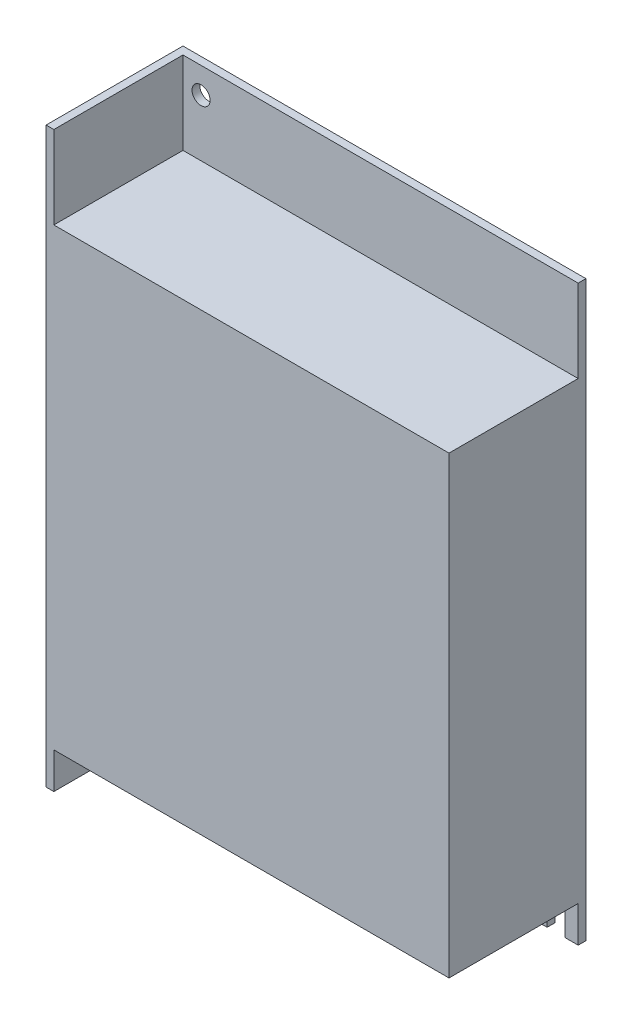
ISO-10303-21;
HEADER;
FILE_DESCRIPTION(('STEP AP214'),'2;1');
FILE_NAME('part.step','',(''),(''),'','','');
FILE_SCHEMA(('AUTOMOTIVE_DESIGN { 1 0 10303 214 1 1 1 1 }'));
ENDSEC;
DATA;
#1=APPLICATION_CONTEXT('core data for automotive mechanical design processes');
#2=APPLICATION_PROTOCOL_DEFINITION('international standard','automotive_design',2000,#1);
#3=PRODUCT_CONTEXT('',#1,'mechanical');
#4=PRODUCT('Part','Part','',(#3));
#5=PRODUCT_RELATED_PRODUCT_CATEGORY('part','',(#4));
#6=PRODUCT_DEFINITION_FORMATION('','',#4);
#7=PRODUCT_DEFINITION_CONTEXT('part definition',#1,'design');
#8=PRODUCT_DEFINITION('design','',#6,#7);
#9=PRODUCT_DEFINITION_SHAPE('','',#8);
#10=(LENGTH_UNIT() NAMED_UNIT(*) SI_UNIT(.MILLI.,.METRE.));
#11=(NAMED_UNIT(*) PLANE_ANGLE_UNIT() SI_UNIT($,.RADIAN.));
#12=(NAMED_UNIT(*) SI_UNIT($,.STERADIAN.) SOLID_ANGLE_UNIT());
#13=UNCERTAINTY_MEASURE_WITH_UNIT(LENGTH_MEASURE(1.E-05),#10,'distance_accuracy_value','');
#14=(GEOMETRIC_REPRESENTATION_CONTEXT(3) GLOBAL_UNCERTAINTY_ASSIGNED_CONTEXT((#13)) GLOBAL_UNIT_ASSIGNED_CONTEXT((#10,
#11,#12)) REPRESENTATION_CONTEXT('',''));
#15=CARTESIAN_POINT('',(0.,0.,0.));
#16=DIRECTION('',(0.,0.,1.));
#17=DIRECTION('',(1.,0.,0.));
#18=AXIS2_PLACEMENT_3D('',#15,#16,#17);
#19=CARTESIAN_POINT('',(0.,0.,1.5));
#20=DIRECTION('',(0.,0.,1.));
#21=DIRECTION('',(1.,0.,0.));
#22=AXIS2_PLACEMENT_3D('',#19,#20,#21);
#23=PLANE('',#22);
#24=CARTESIAN_POINT('',(5.,106.,1.5));
#25=DIRECTION('',(0.,0.,1.));
#26=DIRECTION('',(1.,0.,0.));
#27=AXIS2_PLACEMENT_3D('',#24,#25,#26);
#28=CIRCLE('',#27,1.75);
#29=CARTESIAN_POINT('',(6.75000000000001,106.,1.5));
#30=VERTEX_POINT('',#29);
#31=EDGE_CURVE('E173',#30,#30,#28,.T.);
#32=ORIENTED_EDGE('',*,*,#31,.F.);
#33=EDGE_LOOP('',(#32));
#34=FACE_BOUND('',#33,.T.);
#35=DIRECTION('',(0.,-1.,0.));
#36=VECTOR('',#35,1.);
#37=CARTESIAN_POINT('',(1.50000000000001,0.,1.5));
#38=LINE('',#37,#36);
#39=CARTESIAN_POINT('',(1.5,111.,1.5));
#40=VERTEX_POINT('',#39);
#41=CARTESIAN_POINT('',(1.5,95.,1.5));
#42=VERTEX_POINT('',#41);
#43=EDGE_CURVE('E300',#40,#42,#38,.T.);
#44=ORIENTED_EDGE('',*,*,#43,.T.);
#45=DIRECTION('',(1.,0.,0.));
#46=VECTOR('',#45,1.);
#47=CARTESIAN_POINT('',(0.,95.,1.5));
#48=LINE('',#47,#46);
#49=CARTESIAN_POINT('',(78.,95.,1.5));
#50=VERTEX_POINT('',#49);
#51=EDGE_CURVE('E50',#42,#50,#48,.T.);
#52=ORIENTED_EDGE('',*,*,#51,.T.);
#53=DIRECTION('',(0.,1.,0.));
#54=VECTOR('',#53,1.);
#55=CARTESIAN_POINT('',(78.,0.,1.5));
#56=LINE('',#55,#54);
#57=CARTESIAN_POINT('',(78.,111.,1.5));
#58=VERTEX_POINT('',#57);
#59=EDGE_CURVE('E125',#50,#58,#56,.T.);
#60=ORIENTED_EDGE('',*,*,#59,.T.);
#61=DIRECTION('',(1.,0.,0.));
#62=VECTOR('',#61,1.);
#63=CARTESIAN_POINT('',(0.,111.,1.5));
#64=LINE('',#63,#62);
#65=EDGE_CURVE('E107',#40,#58,#64,.T.);
#66=ORIENTED_EDGE('',*,*,#65,.F.);
#67=EDGE_LOOP('',(#44,#52,#60,#66));
#68=FACE_BOUND('',#67,.T.);
#69=ADVANCED_FACE('F35',(#34,#68),#23,.T.);
#70=CARTESIAN_POINT('',(73.75,4.24999999999999,1.5));
#71=DIRECTION('',(0.,0.,-1.));
#72=DIRECTION('',(-1.,0.,0.));
#73=AXIS2_PLACEMENT_3D('',#70,#71,#72);
#74=CYLINDRICAL_SURFACE('',#73,1.75);
#75=CARTESIAN_POINT('',(73.75,4.24999999999999,0.));
#76=DIRECTION('',(0.,0.,1.));
#77=DIRECTION('',(1.,0.,0.));
#78=AXIS2_PLACEMENT_3D('',#75,#76,#77);
#79=CIRCLE('',#78,1.75);
#80=CARTESIAN_POINT('',(75.5,4.24999999999999,0.));
#81=VERTEX_POINT('',#80);
#82=CARTESIAN_POINT('',(72.,4.24999999999999,0.));
#83=VERTEX_POINT('',#82);
#84=EDGE_CURVE('E156',#81,#83,#79,.T.);
#85=ORIENTED_EDGE('',*,*,#84,.F.);
#86=DIRECTION('',(0.,0.,-1.));
#87=VECTOR('',#86,1.);
#88=CARTESIAN_POINT('',(75.5,4.24999999999999,1.5));
#89=LINE('',#88,#87);
#90=CARTESIAN_POINT('',(75.5,4.24999999999999,1.5));
#91=VERTEX_POINT('',#90);
#92=EDGE_CURVE('E11',#91,#81,#89,.T.);
#93=ORIENTED_EDGE('',*,*,#92,.F.);
#94=CARTESIAN_POINT('',(73.75,4.24999999999999,1.5));
#95=DIRECTION('',(0.,0.,1.));
#96=DIRECTION('',(1.,0.,0.));
#97=AXIS2_PLACEMENT_3D('',#94,#95,#96);
#98=CIRCLE('',#97,1.75);
#99=CARTESIAN_POINT('',(72.,4.24999999999999,1.5));
#100=VERTEX_POINT('',#99);
#101=EDGE_CURVE('E210',#91,#100,#98,.T.);
#102=ORIENTED_EDGE('',*,*,#101,.T.);
#103=DIRECTION('',(0.,0.,-1.));
#104=VECTOR('',#103,1.);
#105=CARTESIAN_POINT('',(72.,4.24999999999999,1.5));
#106=LINE('',#105,#104);
#107=EDGE_CURVE('E59',#100,#83,#106,.T.);
#108=ORIENTED_EDGE('',*,*,#107,.T.);
#109=EDGE_LOOP('',(#85,#93,#102,#108));
#110=FACE_BOUND('',#109,.T.);
#111=ADVANCED_FACE('F229',(#110),#74,.F.);
#112=CARTESIAN_POINT('',(75.5,0.,1.5));
#113=DIRECTION('',(1.,0.,0.));
#114=DIRECTION('',(0.,0.,-1.));
#115=AXIS2_PLACEMENT_3D('',#112,#113,#114);
#116=PLANE('',#115);
#117=DIRECTION('',(0.,-1.,0.));
#118=VECTOR('',#117,1.);
#119=CARTESIAN_POINT('',(75.5,0.,0.));
#120=LINE('',#119,#118);
#121=CARTESIAN_POINT('',(75.5,0.,0.));
#122=VERTEX_POINT('',#121);
#123=EDGE_CURVE('E153',#81,#122,#120,.T.);
#124=ORIENTED_EDGE('',*,*,#123,.T.);
#125=DIRECTION('',(0.,0.,-1.));
#126=VECTOR('',#125,1.);
#127=CARTESIAN_POINT('',(75.5,0.,1.5));
#128=LINE('',#127,#126);
#129=CARTESIAN_POINT('',(75.5,0.,1.5));
#130=VERTEX_POINT('',#129);
#131=EDGE_CURVE('E43',#130,#122,#128,.T.);
#132=ORIENTED_EDGE('',*,*,#131,.F.);
#133=DIRECTION('',(0.,-1.,0.));
#134=VECTOR('',#133,1.);
#135=CARTESIAN_POINT('',(75.5,0.,1.5));
#136=LINE('',#135,#134);
#137=EDGE_CURVE('E208',#91,#130,#136,.T.);
#138=ORIENTED_EDGE('',*,*,#137,.F.);
#139=ORIENTED_EDGE('',*,*,#92,.T.);
#140=EDGE_LOOP('',(#124,#132,#138,#139));
#141=FACE_BOUND('',#140,.T.);
#142=ADVANCED_FACE('F154',(#141),#116,.F.);
#143=CARTESIAN_POINT('',(0.,0.,1.5));
#144=DIRECTION('',(0.,1.,0.));
#145=DIRECTION('',(0.,0.,1.));
#146=AXIS2_PLACEMENT_3D('',#143,#144,#145);
#147=PLANE('',#146);
#148=DIRECTION('',(1.,0.,0.));
#149=VECTOR('',#148,1.);
#150=CARTESIAN_POINT('',(0.,0.,0.));
#151=LINE('',#150,#149);
#152=CARTESIAN_POINT('',(78.,0.,0.));
#153=VERTEX_POINT('',#152);
#154=EDGE_CURVE('E148',#122,#153,#151,.T.);
#155=ORIENTED_EDGE('',*,*,#154,.T.);
#156=DIRECTION('',(0.,0.,-1.));
#157=VECTOR('',#156,1.);
#158=CARTESIAN_POINT('',(78.,0.,1.5));
#159=LINE('',#158,#157);
#160=CARTESIAN_POINT('',(78.,0.,1.5));
#161=VERTEX_POINT('',#160);
#162=EDGE_CURVE('E134',#161,#153,#159,.T.);
#163=ORIENTED_EDGE('',*,*,#162,.F.);
#164=DIRECTION('',(1.,0.,0.));
#165=VECTOR('',#164,1.);
#166=CARTESIAN_POINT('',(0.,0.,1.5));
#167=LINE('',#166,#165);
#168=EDGE_CURVE('E128',#130,#161,#167,.T.);
#169=ORIENTED_EDGE('',*,*,#168,.F.);
#170=ORIENTED_EDGE('',*,*,#131,.T.);
#171=EDGE_LOOP('',(#155,#163,#169,#170));
#172=FACE_BOUND('',#171,.T.);
#173=ADVANCED_FACE('F146',(#172),#147,.F.);
#174=CARTESIAN_POINT('',(78.,0.,1.5));
#175=DIRECTION('',(-1.,0.,0.));
#176=DIRECTION('',(0.,0.,1.));
#177=AXIS2_PLACEMENT_3D('',#174,#175,#176);
#178=PLANE('',#177);
#179=DIRECTION('',(0.,1.,0.));
#180=VECTOR('',#179,1.);
#181=CARTESIAN_POINT('',(78.,0.,0.));
#182=LINE('',#181,#180);
#183=CARTESIAN_POINT('',(78.,111.,0.));
#184=VERTEX_POINT('',#183);
#185=EDGE_CURVE('E132',#153,#184,#182,.T.);
#186=ORIENTED_EDGE('',*,*,#185,.T.);
#187=DIRECTION('',(0.,0.,-1.));
#188=VECTOR('',#187,1.);
#189=CARTESIAN_POINT('',(78.,111.,1.5));
#190=LINE('',#189,#188);
#191=EDGE_CURVE('E112',#58,#184,#190,.T.);
#192=ORIENTED_EDGE('',*,*,#191,.F.);
#193=ORIENTED_EDGE('',*,*,#59,.F.);
#194=DIRECTION('',(0.,0.,-1.));
#195=VECTOR('',#194,1.);
#196=CARTESIAN_POINT('',(78.,95.,26.5));
#197=LINE('',#196,#195);
#198=CARTESIAN_POINT('',(78.,95.,26.5));
#199=VERTEX_POINT('',#198);
#200=EDGE_CURVE('E298',#199,#50,#197,.T.);
#201=ORIENTED_EDGE('',*,*,#200,.F.);
#202=DIRECTION('',(0.,1.,0.));
#203=VECTOR('',#202,1.);
#204=CARTESIAN_POINT('',(78.,0.,26.5));
#205=LINE('',#204,#203);
#206=CARTESIAN_POINT('',(78.,7.,26.5));
#207=VERTEX_POINT('',#206);
#208=EDGE_CURVE('E279',#207,#199,#205,.T.);
#209=ORIENTED_EDGE('',*,*,#208,.F.);
#210=DIRECTION('',(0.,0.,-1.));
#211=VECTOR('',#210,1.);
#212=CARTESIAN_POINT('',(78.,7.,26.5));
#213=LINE('',#212,#211);
#214=CARTESIAN_POINT('',(78.,7.,1.5));
#215=VERTEX_POINT('',#214);
#216=EDGE_CURVE('E203',#207,#215,#213,.T.);
#217=ORIENTED_EDGE('',*,*,#216,.T.);
#218=EDGE_CURVE('E122',#161,#215,#56,.T.);
#219=ORIENTED_EDGE('',*,*,#218,.F.);
#220=ORIENTED_EDGE('',*,*,#162,.T.);
#221=EDGE_LOOP('',(#186,#192,#193,#201,#209,#217,#219,#220));
#222=FACE_BOUND('',#221,.T.);
#223=ADVANCED_FACE('F130',(#222),#178,.F.);
#224=CARTESIAN_POINT('',(0.,111.,1.5));
#225=DIRECTION('',(0.,1.,0.));
#226=DIRECTION('',(0.,0.,1.));
#227=AXIS2_PLACEMENT_3D('',#224,#225,#226);
#228=PLANE('',#227);
#229=DIRECTION('',(1.,0.,0.));
#230=VECTOR('',#229,1.);
#231=CARTESIAN_POINT('',(0.,111.,0.));
#232=LINE('',#231,#230);
#233=CARTESIAN_POINT('',(0.,111.,0.));
#234=VERTEX_POINT('',#233);
#235=EDGE_CURVE('E165',#234,#184,#232,.T.);
#236=ORIENTED_EDGE('',*,*,#235,.F.);
#237=DIRECTION('',(0.,0.,-1.));
#238=VECTOR('',#237,1.);
#239=CARTESIAN_POINT('',(0.,111.,1.5));
#240=LINE('',#239,#238);
#241=CARTESIAN_POINT('',(0.,111.,26.5));
#242=VERTEX_POINT('',#241);
#243=EDGE_CURVE('E135',#242,#234,#240,.T.);
#244=ORIENTED_EDGE('',*,*,#243,.F.);
#245=DIRECTION('',(-1.,0.,0.));
#246=VECTOR('',#245,1.);
#247=CARTESIAN_POINT('',(0.,111.,26.5));
#248=LINE('',#247,#246);
#249=CARTESIAN_POINT('',(1.5,111.,26.5));
#250=VERTEX_POINT('',#249);
#251=EDGE_CURVE('E283',#250,#242,#248,.T.);
#252=ORIENTED_EDGE('',*,*,#251,.F.);
#253=DIRECTION('',(0.,0.,-1.));
#254=VECTOR('',#253,1.);
#255=CARTESIAN_POINT('',(1.5,111.,26.5));
#256=LINE('',#255,#254);
#257=EDGE_CURVE('E117',#250,#40,#256,.T.);
#258=ORIENTED_EDGE('',*,*,#257,.T.);
#259=ORIENTED_EDGE('',*,*,#65,.T.);
#260=ORIENTED_EDGE('',*,*,#191,.T.);
#261=EDGE_LOOP('',(#236,#244,#252,#258,#259,#260));
#262=FACE_BOUND('',#261,.T.);
#263=ADVANCED_FACE('F110',(#262),#228,.T.);
#264=CARTESIAN_POINT('',(0.,0.,1.5));
#265=DIRECTION('',(-1.,0.,0.));
#266=DIRECTION('',(0.,0.,1.));
#267=AXIS2_PLACEMENT_3D('',#264,#265,#266);
#268=PLANE('',#267);
#269=DIRECTION('',(0.,1.,0.));
#270=VECTOR('',#269,1.);
#271=CARTESIAN_POINT('',(0.,0.,0.));
#272=LINE('',#271,#270);
#273=CARTESIAN_POINT('',(0.,0.,0.));
#274=VERTEX_POINT('',#273);
#275=EDGE_CURVE('E167',#274,#234,#272,.T.);
#276=ORIENTED_EDGE('',*,*,#275,.F.);
#277=DIRECTION('',(0.,0.,-1.));
#278=VECTOR('',#277,1.);
#279=CARTESIAN_POINT('',(0.,0.,1.5));
#280=LINE('',#279,#278);
#281=CARTESIAN_POINT('',(0.,0.,26.5));
#282=VERTEX_POINT('',#281);
#283=EDGE_CURVE('E138',#282,#274,#280,.T.);
#284=ORIENTED_EDGE('',*,*,#283,.F.);
#285=DIRECTION('',(0.,-1.,0.));
#286=VECTOR('',#285,1.);
#287=CARTESIAN_POINT('',(0.,0.,26.5));
#288=LINE('',#287,#286);
#289=EDGE_CURVE('E196',#242,#282,#288,.T.);
#290=ORIENTED_EDGE('',*,*,#289,.F.);
#291=ORIENTED_EDGE('',*,*,#243,.T.);
#292=EDGE_LOOP('',(#276,#284,#290,#291));
#293=FACE_BOUND('',#292,.T.);
#294=ADVANCED_FACE('F193',(#293),#268,.T.);
#295=CARTESIAN_POINT('',(72.,0.,0.));
#296=VERTEX_POINT('',#295);
#297=EDGE_CURVE('E159',#274,#296,#151,.T.);
#298=ORIENTED_EDGE('',*,*,#297,.T.);
#299=DIRECTION('',(0.,0.,-1.));
#300=VECTOR('',#299,1.);
#301=CARTESIAN_POINT('',(72.,0.,1.5));
#302=LINE('',#301,#300);
#303=CARTESIAN_POINT('',(72.,0.,1.5));
#304=VERTEX_POINT('',#303);
#305=EDGE_CURVE('E175',#304,#296,#302,.T.);
#306=ORIENTED_EDGE('',*,*,#305,.F.);
#307=CARTESIAN_POINT('',(1.50000000000001,0.,1.5));
#308=VERTEX_POINT('',#307);
#309=EDGE_CURVE('E121',#308,#304,#167,.T.);
#310=ORIENTED_EDGE('',*,*,#309,.F.);
#311=DIRECTION('',(0.,0.,-1.));
#312=VECTOR('',#311,1.);
#313=CARTESIAN_POINT('',(1.50000000000001,0.,26.5));
#314=LINE('',#313,#312);
#315=CARTESIAN_POINT('',(1.50000000000001,0.,26.5));
#316=VERTEX_POINT('',#315);
#317=EDGE_CURVE('E223',#316,#308,#314,.T.);
#318=ORIENTED_EDGE('',*,*,#317,.F.);
#319=DIRECTION('',(1.,0.,0.));
#320=VECTOR('',#319,1.);
#321=CARTESIAN_POINT('',(0.,0.,26.5));
#322=LINE('',#321,#320);
#323=EDGE_CURVE('E187',#282,#316,#322,.T.);
#324=ORIENTED_EDGE('',*,*,#323,.F.);
#325=ORIENTED_EDGE('',*,*,#283,.T.);
#326=EDGE_LOOP('',(#298,#306,#310,#318,#324,#325));
#327=FACE_BOUND('',#326,.T.);
#328=ADVANCED_FACE('F182',(#327),#147,.F.);
#329=CARTESIAN_POINT('',(5.,106.,1.5));
#330=DIRECTION('',(0.,0.,-1.));
#331=DIRECTION('',(-1.,0.,0.));
#332=AXIS2_PLACEMENT_3D('',#329,#330,#331);
#333=CYLINDRICAL_SURFACE('',#332,1.75);
#334=ORIENTED_EDGE('',*,*,#31,.T.);
#335=EDGE_LOOP('',(#334));
#336=FACE_BOUND('',#335,.T.);
#337=CARTESIAN_POINT('',(5.,106.,0.));
#338=DIRECTION('',(0.,0.,1.));
#339=DIRECTION('',(1.,0.,0.));
#340=AXIS2_PLACEMENT_3D('',#337,#338,#339);
#341=CIRCLE('',#340,1.75);
#342=CARTESIAN_POINT('',(6.75000000000001,106.,0.));
#343=VERTEX_POINT('',#342);
#344=EDGE_CURVE('E160',#343,#343,#341,.T.);
#345=ORIENTED_EDGE('',*,*,#344,.F.);
#346=EDGE_LOOP('',(#345));
#347=FACE_BOUND('',#346,.T.);
#348=ADVANCED_FACE('F37',(#336,#347),#333,.F.);
#349=CARTESIAN_POINT('',(72.,0.,1.5));
#350=DIRECTION('',(1.,0.,0.));
#351=DIRECTION('',(0.,0.,-1.));
#352=AXIS2_PLACEMENT_3D('',#349,#350,#351);
#353=PLANE('',#352);
#354=DIRECTION('',(0.,-1.,0.));
#355=VECTOR('',#354,1.);
#356=CARTESIAN_POINT('',(72.,0.,0.));
#357=LINE('',#356,#355);
#358=EDGE_CURVE('E170',#83,#296,#357,.T.);
#359=ORIENTED_EDGE('',*,*,#358,.F.);
#360=ORIENTED_EDGE('',*,*,#107,.F.);
#361=DIRECTION('',(0.,-1.,0.));
#362=VECTOR('',#361,1.);
#363=CARTESIAN_POINT('',(72.,0.,1.5));
#364=LINE('',#363,#362);
#365=EDGE_CURVE('E176',#100,#304,#364,.T.);
#366=ORIENTED_EDGE('',*,*,#365,.T.);
#367=ORIENTED_EDGE('',*,*,#305,.T.);
#368=EDGE_LOOP('',(#359,#360,#366,#367));
#369=FACE_BOUND('',#368,.T.);
#370=ADVANCED_FACE('F247',(#369),#353,.T.);
#371=DIRECTION('',(1.,0.,0.));
#372=VECTOR('',#371,1.);
#373=CARTESIAN_POINT('',(0.,7.,1.5));
#374=LINE('',#373,#372);
#375=CARTESIAN_POINT('',(1.50000000000001,7.,1.5));
#376=VERTEX_POINT('',#375);
#377=EDGE_CURVE('E281',#376,#215,#374,.T.);
#378=ORIENTED_EDGE('',*,*,#377,.F.);
#379=EDGE_CURVE('E302',#376,#308,#38,.T.);
#380=ORIENTED_EDGE('',*,*,#379,.T.);
#381=ORIENTED_EDGE('',*,*,#309,.T.);
#382=ORIENTED_EDGE('',*,*,#365,.F.);
#383=ORIENTED_EDGE('',*,*,#101,.F.);
#384=ORIENTED_EDGE('',*,*,#137,.T.);
#385=ORIENTED_EDGE('',*,*,#168,.T.);
#386=ORIENTED_EDGE('',*,*,#218,.T.);
#387=EDGE_LOOP('',(#378,#380,#381,#382,#383,#384,#385,#386));
#388=FACE_BOUND('',#387,.T.);
#389=ADVANCED_FACE('F206',(#388),#23,.T.);
#390=CARTESIAN_POINT('',(0.,0.,0.));
#391=DIRECTION('',(0.,0.,1.));
#392=DIRECTION('',(1.,0.,0.));
#393=AXIS2_PLACEMENT_3D('',#390,#391,#392);
#394=PLANE('',#393);
#395=ORIENTED_EDGE('',*,*,#344,.T.);
#396=EDGE_LOOP('',(#395));
#397=FACE_BOUND('',#396,.T.);
#398=ORIENTED_EDGE('',*,*,#84,.T.);
#399=ORIENTED_EDGE('',*,*,#358,.T.);
#400=ORIENTED_EDGE('',*,*,#297,.F.);
#401=ORIENTED_EDGE('',*,*,#275,.T.);
#402=ORIENTED_EDGE('',*,*,#235,.T.);
#403=ORIENTED_EDGE('',*,*,#185,.F.);
#404=ORIENTED_EDGE('',*,*,#154,.F.);
#405=ORIENTED_EDGE('',*,*,#123,.F.);
#406=EDGE_LOOP('',(#398,#399,#400,#401,#402,#403,#404,#405));
#407=FACE_BOUND('',#406,.T.);
#408=ADVANCED_FACE('F192',(#397,#407),#394,.F.);
#409=CARTESIAN_POINT('',(0.,95.,26.5));
#410=DIRECTION('',(0.,1.,0.));
#411=DIRECTION('',(0.,0.,1.));
#412=AXIS2_PLACEMENT_3D('',#409,#410,#411);
#413=PLANE('',#412);
#414=ORIENTED_EDGE('',*,*,#51,.F.);
#415=DIRECTION('',(0.,0.,-1.));
#416=VECTOR('',#415,1.);
#417=CARTESIAN_POINT('',(1.5,95.,26.5));
#418=LINE('',#417,#416);
#419=CARTESIAN_POINT('',(1.5,95.,26.5));
#420=VERTEX_POINT('',#419);
#421=EDGE_CURVE('E217',#420,#42,#418,.T.);
#422=ORIENTED_EDGE('',*,*,#421,.F.);
#423=DIRECTION('',(1.,0.,0.));
#424=VECTOR('',#423,1.);
#425=CARTESIAN_POINT('',(0.,95.,26.5));
#426=LINE('',#425,#424);
#427=EDGE_CURVE('E275',#420,#199,#426,.T.);
#428=ORIENTED_EDGE('',*,*,#427,.T.);
#429=ORIENTED_EDGE('',*,*,#200,.T.);
#430=EDGE_LOOP('',(#414,#422,#428,#429));
#431=FACE_BOUND('',#430,.T.);
#432=ADVANCED_FACE('F251',(#431),#413,.T.);
#433=CARTESIAN_POINT('',(1.50000000000001,0.,26.5));
#434=DIRECTION('',(1.,0.,0.));
#435=DIRECTION('',(0.,1.,0.));
#436=AXIS2_PLACEMENT_3D('',#433,#434,#435);
#437=PLANE('',#436);
#438=ORIENTED_EDGE('',*,*,#43,.F.);
#439=ORIENTED_EDGE('',*,*,#257,.F.);
#440=DIRECTION('',(0.,-1.,0.));
#441=VECTOR('',#440,1.);
#442=CARTESIAN_POINT('',(1.50000000000001,0.,26.5));
#443=LINE('',#442,#441);
#444=EDGE_CURVE('E277',#250,#420,#443,.T.);
#445=ORIENTED_EDGE('',*,*,#444,.T.);
#446=ORIENTED_EDGE('',*,*,#421,.T.);
#447=EDGE_LOOP('',(#438,#439,#445,#446));
#448=FACE_BOUND('',#447,.T.);
#449=ADVANCED_FACE('F256',(#448),#437,.T.);
#450=ORIENTED_EDGE('',*,*,#379,.F.);
#451=DIRECTION('',(0.,0.,-1.));
#452=VECTOR('',#451,1.);
#453=CARTESIAN_POINT('',(1.50000000000001,7.,26.5));
#454=LINE('',#453,#452);
#455=CARTESIAN_POINT('',(1.50000000000001,7.,26.5));
#456=VERTEX_POINT('',#455);
#457=EDGE_CURVE('E307',#456,#376,#454,.T.);
#458=ORIENTED_EDGE('',*,*,#457,.F.);
#459=EDGE_CURVE('E285',#456,#316,#443,.T.);
#460=ORIENTED_EDGE('',*,*,#459,.T.);
#461=ORIENTED_EDGE('',*,*,#317,.T.);
#462=EDGE_LOOP('',(#450,#458,#460,#461));
#463=FACE_BOUND('',#462,.T.);
#464=ADVANCED_FACE('F257',(#463),#437,.T.);
#465=CARTESIAN_POINT('',(0.,7.,26.5));
#466=DIRECTION('',(0.,1.,0.));
#467=DIRECTION('',(0.,0.,1.));
#468=AXIS2_PLACEMENT_3D('',#465,#466,#467);
#469=PLANE('',#468);
#470=ORIENTED_EDGE('',*,*,#377,.T.);
#471=ORIENTED_EDGE('',*,*,#216,.F.);
#472=DIRECTION('',(1.,0.,0.));
#473=VECTOR('',#472,1.);
#474=CARTESIAN_POINT('',(0.,7.,26.5));
#475=LINE('',#474,#473);
#476=EDGE_CURVE('E288',#456,#207,#475,.T.);
#477=ORIENTED_EDGE('',*,*,#476,.F.);
#478=ORIENTED_EDGE('',*,*,#457,.T.);
#479=EDGE_LOOP('',(#470,#471,#477,#478));
#480=FACE_BOUND('',#479,.T.);
#481=ADVANCED_FACE('F260',(#480),#469,.F.);
#482=CARTESIAN_POINT('',(0.,0.,26.5));
#483=DIRECTION('',(0.,0.,1.));
#484=DIRECTION('',(1.,0.,0.));
#485=AXIS2_PLACEMENT_3D('',#482,#483,#484);
#486=PLANE('',#485);
#487=ORIENTED_EDGE('',*,*,#427,.F.);
#488=ORIENTED_EDGE('',*,*,#444,.F.);
#489=ORIENTED_EDGE('',*,*,#251,.T.);
#490=ORIENTED_EDGE('',*,*,#289,.T.);
#491=ORIENTED_EDGE('',*,*,#323,.T.);
#492=ORIENTED_EDGE('',*,*,#459,.F.);
#493=ORIENTED_EDGE('',*,*,#476,.T.);
#494=ORIENTED_EDGE('',*,*,#208,.T.);
#495=EDGE_LOOP('',(#487,#488,#489,#490,#491,#492,#493,#494));
#496=FACE_BOUND('',#495,.T.);
#497=ADVANCED_FACE('F264',(#496),#486,.T.);
#498=CLOSED_SHELL('',(#69,#111,#142,#173,#223,#263,#294,#328,#348,#370,#389,#408,#432,#449,#464,
#481,#497));
#499=MANIFOLD_SOLID_BREP('B2',#498);
#500=ADVANCED_BREP_SHAPE_REPRESENTATION('',(#18,#499),#14);
#501=SHAPE_DEFINITION_REPRESENTATION(#9,#500);
ENDSEC;
END-ISO-10303-21;
